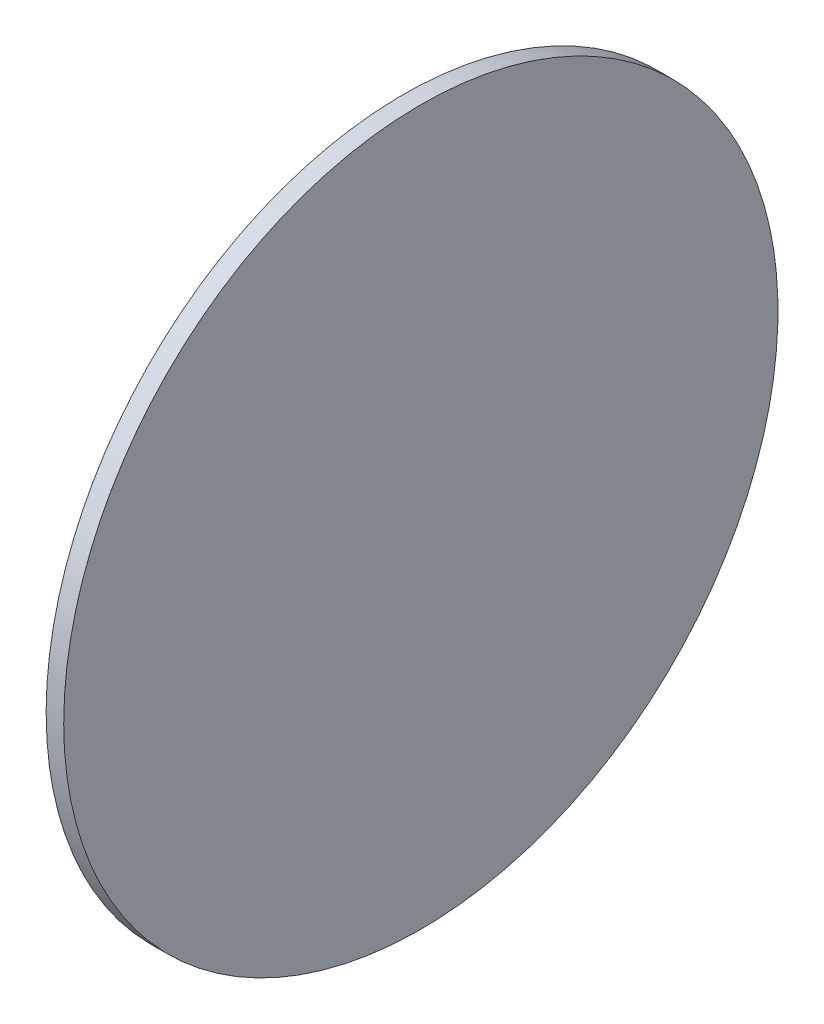
ISO-10303-21;
HEADER;
FILE_DESCRIPTION(('STEP AP214'),'2;1');
FILE_NAME('part.step','',(''),(''),'','','');
FILE_SCHEMA(('AUTOMOTIVE_DESIGN { 1 0 10303 214 1 1 1 1 }'));
ENDSEC;
DATA;
#1=APPLICATION_CONTEXT('core data for automotive mechanical design processes');
#2=APPLICATION_PROTOCOL_DEFINITION('international standard','automotive_design',2000,#1);
#3=PRODUCT_CONTEXT('',#1,'mechanical');
#4=PRODUCT('Part','Part','',(#3));
#5=PRODUCT_RELATED_PRODUCT_CATEGORY('part','',(#4));
#6=PRODUCT_DEFINITION_FORMATION('','',#4);
#7=PRODUCT_DEFINITION_CONTEXT('part definition',#1,'design');
#8=PRODUCT_DEFINITION('design','',#6,#7);
#9=PRODUCT_DEFINITION_SHAPE('','',#8);
#10=(LENGTH_UNIT() NAMED_UNIT(*) SI_UNIT(.MILLI.,.METRE.));
#11=(NAMED_UNIT(*) PLANE_ANGLE_UNIT() SI_UNIT($,.RADIAN.));
#12=(NAMED_UNIT(*) SI_UNIT($,.STERADIAN.) SOLID_ANGLE_UNIT());
#13=UNCERTAINTY_MEASURE_WITH_UNIT(LENGTH_MEASURE(1.E-05),#10,'distance_accuracy_value','');
#14=(GEOMETRIC_REPRESENTATION_CONTEXT(3) GLOBAL_UNCERTAINTY_ASSIGNED_CONTEXT((#13)) GLOBAL_UNIT_ASSIGNED_CONTEXT((#10,
#11,#12)) REPRESENTATION_CONTEXT('',''));
#15=CARTESIAN_POINT('',(0.,0.,0.));
#16=DIRECTION('',(0.,0.,1.));
#17=DIRECTION('',(1.,0.,0.));
#18=AXIS2_PLACEMENT_3D('',#15,#16,#17);
#19=CARTESIAN_POINT('',(458.240366113346,276.116733993281,45.9428043668599));
#20=CARTESIAN_POINT('',(458.240366113346,273.191267889218,45.9428043668599));
#21=CARTESIAN_POINT('',(458.240366113346,267.340335681094,45.65536649926));
#22=CARTESIAN_POINT('',(458.240366113346,258.648458882321,44.3660483707524));
#23=CARTESIAN_POINT('',(458.240366113346,250.124811121997,42.2309857535274));
#24=CARTESIAN_POINT('',(458.240366113346,241.851479787554,39.2707404677329));
#25=CARTESIAN_POINT('',(458.240366113346,233.908141582405,35.5138212937059));
#26=CARTESIAN_POINT('',(458.240366113346,226.371295195737,30.996409416833));
#27=CARTESIAN_POINT('',(458.240366113346,219.313524578312,25.7620099829571));
#28=CARTESIAN_POINT('',(458.240366113346,212.802799919346,19.8610331200402));
#29=CARTESIAN_POINT('',(458.240366113346,206.90182305643,13.3503084610744));
#30=CARTESIAN_POINT('',(458.240366113346,201.667423622554,6.29253784364952));
#31=CARTESIAN_POINT('',(458.240366113346,197.150011745681,-1.24430854301872));
#32=CARTESIAN_POINT('',(458.240366113346,193.393092571654,-9.18764674816733));
#33=CARTESIAN_POINT('',(458.240366113346,190.432847285859,-17.4609780826104));
#34=CARTESIAN_POINT('',(458.240366113346,188.297784668634,-25.9846258429343));
#35=CARTESIAN_POINT('',(458.240366113346,187.008466540127,-34.6765026417073));
#36=CARTESIAN_POINT('',(458.240366113346,186.577309738727,-43.452900953894));
#37=CARTESIAN_POINT('',(458.240366113346,187.008466540127,-52.2292992660806));
#38=CARTESIAN_POINT('',(458.240366113346,188.297784668634,-60.9211760648535));
#39=CARTESIAN_POINT('',(458.240366113346,190.432847285859,-69.4448238251775));
#40=CARTESIAN_POINT('',(458.240366113346,193.393092571654,-77.7181551596206));
#41=CARTESIAN_POINT('',(458.240366113346,197.150011745681,-85.6614933647691));
#42=CARTESIAN_POINT('',(458.240366113346,201.667423622554,-93.1983397514374));
#43=CARTESIAN_POINT('',(458.240366113346,206.90182305643,-100.256110368862));
#44=CARTESIAN_POINT('',(458.240366113346,212.802799919347,-106.766835027828));
#45=CARTESIAN_POINT('',(458.240366113346,219.313524578312,-112.667811890745));
#46=CARTESIAN_POINT('',(458.240366113346,226.371295195737,-117.902211324621));
#47=CARTESIAN_POINT('',(458.240366113346,233.908141582405,-122.419623201494));
#48=CARTESIAN_POINT('',(458.240366113346,241.851479787554,-126.176542375521));
#49=CARTESIAN_POINT('',(458.240366113346,250.124811121997,-129.136787661315));
#50=CARTESIAN_POINT('',(458.240366113346,258.648458882321,-131.27185027854));
#51=CARTESIAN_POINT('',(458.240366113346,267.340335681094,-132.561168407048));
#52=CARTESIAN_POINT('',(458.240366113346,276.116733993281,-132.992325208448));
#53=CARTESIAN_POINT('',(458.240366113346,284.893132305467,-132.561168407048));
#54=CARTESIAN_POINT('',(458.240366113346,293.58500910424,-131.27185027854));
#55=CARTESIAN_POINT('',(458.240366113346,302.108656864564,-129.136787661315));
#56=CARTESIAN_POINT('',(458.240366113346,310.381988199007,-126.176542375521));
#57=CARTESIAN_POINT('',(458.240366113346,318.325326404156,-122.419623201494));
#58=CARTESIAN_POINT('',(458.240366113346,325.862172790824,-117.902211324621));
#59=CARTESIAN_POINT('',(458.240366113346,332.919943408249,-112.667811890745));
#60=CARTESIAN_POINT('',(458.240366113346,339.430668067215,-106.766835027828));
#61=CARTESIAN_POINT('',(458.240366113346,345.331644930132,-100.256110368862));
#62=CARTESIAN_POINT('',(458.240366113346,350.566044364008,-93.1983397514374));
#63=CARTESIAN_POINT('',(458.240366113346,355.08345624088,-85.6614933647692));
#64=CARTESIAN_POINT('',(458.240366113346,358.840375414908,-77.7181551596207));
#65=CARTESIAN_POINT('',(458.240366113346,361.800620700702,-69.4448238251775));
#66=CARTESIAN_POINT('',(458.240366113346,363.935683317927,-60.9211760648536));
#67=CARTESIAN_POINT('',(458.240366113346,365.225001446435,-52.2292992660807));
#68=CARTESIAN_POINT('',(458.240366113346,365.656158247834,-43.4529009538939));
#69=CARTESIAN_POINT('',(458.240366113346,365.225001446435,-34.6765026417073));
#70=CARTESIAN_POINT('',(458.240366113346,363.935683317927,-25.9846258429344));
#71=CARTESIAN_POINT('',(458.240366113346,361.800620700702,-17.4609780826103));
#72=CARTESIAN_POINT('',(458.240366113346,358.840375414908,-9.18764674816738));
#73=CARTESIAN_POINT('',(458.240366113346,355.08345624088,-1.24430854301868));
#74=CARTESIAN_POINT('',(458.240366113346,350.566044364008,6.29253784364942));
#75=CARTESIAN_POINT('',(458.240366113346,345.331644930132,13.3503084610744));
#76=CARTESIAN_POINT('',(458.240366113346,339.430668067215,19.8610331200402));
#77=CARTESIAN_POINT('',(458.240366113346,332.919943408249,25.7620099829571));
#78=CARTESIAN_POINT('',(458.240366113346,325.862172790824,30.996409416833));
#79=CARTESIAN_POINT('',(458.240366113346,318.325326404156,35.5138212937059));
#80=CARTESIAN_POINT('',(458.240366113346,310.381988199007,39.2707404677329));
#81=CARTESIAN_POINT('',(458.240366113346,302.108656864564,42.2309857535274));
#82=CARTESIAN_POINT('',(458.240366113346,293.58500910424,44.3660483707524));
#83=CARTESIAN_POINT('',(458.240366113346,284.893132305467,45.65536649926));
#84=CARTESIAN_POINT('',(458.240366113346,279.042200097343,45.9428043668599));
#85=CARTESIAN_POINT('',(458.240366113346,276.116733993281,45.9428043668599));
#86=B_SPLINE_CURVE_WITH_KNOTS('',3,(#19,#20,#21,#22,#23,#24,#25,#26,#27,#28,#29,#30,#31,#32,#33,
#34,#35,#36,#37,#38,#39,#40,#41,#42,#43,#44,#45,#46,#47,#48,#49,#50,#51,#52,#53,#54,#55,#56,#57,
#58,#59,#60,#61,#62,#63,#64,#65,#66,#67,#68,#69,#70,#71,#72,#73,#74,#75,#76,#77,#78,#79,#80,#81,
#82,#83,#84,#85),.UNSPECIFIED.,.T.,.F.,(4,1,1,1,1,1,1,1,1,1,1,1,1,1,1,1,1,1,1,1,1,1,1,1,1,1,1,1,
1,1,1,1,1,1,1,1,1,1,1,1,1,1,1,1,1,1,1,1,1,1,1,1,1,1,1,1,1,1,1,1,1,1,1,1,4),(0.,0.015625,0.03125,
0.0468749999999999,0.0625,0.078125,0.09375,0.109375,0.125,0.140625,0.15625,0.171875,0.1875,
0.203125,0.21875,0.234375,0.25,0.265625,0.28125,0.296875,0.3125,0.328125,0.34375,0.359375,0.375,
0.390625,0.40625,0.421875,0.4375,0.453125,0.46875,0.484375,0.5,0.515625,0.53125,0.546875,0.5625,
0.578125,0.59375,0.609375,0.625,0.640625,0.65625,0.671875,0.6875,0.703125,0.71875,0.734375,0.75,
0.765625,0.78125,0.796875,0.8125,0.828125,0.84375,0.859375,0.875,0.890625,0.90625,0.921875,
0.9375,0.953125,0.96875,0.984375,1.),.UNSPECIFIED.);
#87=DIRECTION('',(1.,0.,0.));
#88=VECTOR('',#87,1.);
#89=SURFACE_OF_LINEAR_EXTRUSION('',#86,#88);
#90=CARTESIAN_POINT('',(458.240366113346,276.116733993281,45.9428043668599));
#91=CARTESIAN_POINT('',(458.240366113346,273.191267889218,45.9428043668599));
#92=CARTESIAN_POINT('',(458.240366113346,267.340335681094,45.65536649926));
#93=CARTESIAN_POINT('',(458.240366113346,258.648458882321,44.3660483707524));
#94=CARTESIAN_POINT('',(458.240366113346,250.124811121997,42.2309857535274));
#95=CARTESIAN_POINT('',(458.240366113346,241.851479787554,39.2707404677329));
#96=CARTESIAN_POINT('',(458.240366113346,233.908141582405,35.5138212937059));
#97=CARTESIAN_POINT('',(458.240366113346,226.371295195737,30.996409416833));
#98=CARTESIAN_POINT('',(458.240366113346,219.313524578312,25.7620099829571));
#99=CARTESIAN_POINT('',(458.240366113346,212.802799919346,19.8610331200402));
#100=CARTESIAN_POINT('',(458.240366113346,206.90182305643,13.3503084610744));
#101=CARTESIAN_POINT('',(458.240366113346,201.667423622554,6.29253784364952));
#102=CARTESIAN_POINT('',(458.240366113346,197.150011745681,-1.24430854301872));
#103=CARTESIAN_POINT('',(458.240366113346,193.393092571654,-9.18764674816733));
#104=CARTESIAN_POINT('',(458.240366113346,190.432847285859,-17.4609780826104));
#105=CARTESIAN_POINT('',(458.240366113346,188.297784668634,-25.9846258429343));
#106=CARTESIAN_POINT('',(458.240366113346,187.008466540127,-34.6765026417073));
#107=CARTESIAN_POINT('',(458.240366113346,186.577309738727,-43.452900953894));
#108=CARTESIAN_POINT('',(458.240366113346,187.008466540127,-52.2292992660806));
#109=CARTESIAN_POINT('',(458.240366113346,188.297784668634,-60.9211760648535));
#110=CARTESIAN_POINT('',(458.240366113346,190.432847285859,-69.4448238251775));
#111=CARTESIAN_POINT('',(458.240366113346,193.393092571654,-77.7181551596206));
#112=CARTESIAN_POINT('',(458.240366113346,197.150011745681,-85.6614933647691));
#113=CARTESIAN_POINT('',(458.240366113346,201.667423622554,-93.1983397514374));
#114=CARTESIAN_POINT('',(458.240366113346,206.90182305643,-100.256110368862));
#115=CARTESIAN_POINT('',(458.240366113346,212.802799919347,-106.766835027828));
#116=CARTESIAN_POINT('',(458.240366113346,219.313524578312,-112.667811890745));
#117=CARTESIAN_POINT('',(458.240366113346,226.371295195737,-117.902211324621));
#118=CARTESIAN_POINT('',(458.240366113346,233.908141582405,-122.419623201494));
#119=CARTESIAN_POINT('',(458.240366113346,241.851479787554,-126.176542375521));
#120=CARTESIAN_POINT('',(458.240366113346,250.124811121997,-129.136787661315));
#121=CARTESIAN_POINT('',(458.240366113346,258.648458882321,-131.27185027854));
#122=CARTESIAN_POINT('',(458.240366113346,267.340335681094,-132.561168407048));
#123=CARTESIAN_POINT('',(458.240366113346,276.116733993281,-132.992325208448));
#124=CARTESIAN_POINT('',(458.240366113346,284.893132305467,-132.561168407048));
#125=CARTESIAN_POINT('',(458.240366113346,293.58500910424,-131.27185027854));
#126=CARTESIAN_POINT('',(458.240366113346,302.108656864564,-129.136787661315));
#127=CARTESIAN_POINT('',(458.240366113346,310.381988199007,-126.176542375521));
#128=CARTESIAN_POINT('',(458.240366113346,318.325326404156,-122.419623201494));
#129=CARTESIAN_POINT('',(458.240366113346,325.862172790824,-117.902211324621));
#130=CARTESIAN_POINT('',(458.240366113346,332.919943408249,-112.667811890745));
#131=CARTESIAN_POINT('',(458.240366113346,339.430668067215,-106.766835027828));
#132=CARTESIAN_POINT('',(458.240366113346,345.331644930132,-100.256110368862));
#133=CARTESIAN_POINT('',(458.240366113346,350.566044364008,-93.1983397514374));
#134=CARTESIAN_POINT('',(458.240366113346,355.08345624088,-85.6614933647692));
#135=CARTESIAN_POINT('',(458.240366113346,358.840375414908,-77.7181551596207));
#136=CARTESIAN_POINT('',(458.240366113346,361.800620700702,-69.4448238251775));
#137=CARTESIAN_POINT('',(458.240366113346,363.935683317927,-60.9211760648536));
#138=CARTESIAN_POINT('',(458.240366113346,365.225001446435,-52.2292992660807));
#139=CARTESIAN_POINT('',(458.240366113346,365.656158247834,-43.4529009538939));
#140=CARTESIAN_POINT('',(458.240366113346,365.225001446435,-34.6765026417073));
#141=CARTESIAN_POINT('',(458.240366113346,363.935683317927,-25.9846258429344));
#142=CARTESIAN_POINT('',(458.240366113346,361.800620700702,-17.4609780826103));
#143=CARTESIAN_POINT('',(458.240366113346,358.840375414908,-9.18764674816738));
#144=CARTESIAN_POINT('',(458.240366113346,355.08345624088,-1.24430854301868));
#145=CARTESIAN_POINT('',(458.240366113346,350.566044364008,6.29253784364942));
#146=CARTESIAN_POINT('',(458.240366113346,345.331644930132,13.3503084610744));
#147=CARTESIAN_POINT('',(458.240366113346,339.430668067215,19.8610331200402));
#148=CARTESIAN_POINT('',(458.240366113346,332.919943408249,25.7620099829571));
#149=CARTESIAN_POINT('',(458.240366113346,325.862172790824,30.996409416833));
#150=CARTESIAN_POINT('',(458.240366113346,318.325326404156,35.5138212937059));
#151=CARTESIAN_POINT('',(458.240366113346,310.381988199007,39.2707404677329));
#152=CARTESIAN_POINT('',(458.240366113346,302.108656864564,42.2309857535274));
#153=CARTESIAN_POINT('',(458.240366113346,293.58500910424,44.3660483707524));
#154=CARTESIAN_POINT('',(458.240366113346,284.893132305467,45.65536649926));
#155=CARTESIAN_POINT('',(458.240366113346,279.042200097343,45.9428043668599));
#156=CARTESIAN_POINT('',(458.240366113346,276.116733993281,45.9428043668599));
#157=B_SPLINE_CURVE_WITH_KNOTS('',3,(#90,#91,#92,#93,#94,#95,#96,#97,#98,#99,#100,#101,#102,
#103,#104,#105,#106,#107,#108,#109,#110,#111,#112,#113,#114,#115,#116,#117,#118,#119,#120,#121,
#122,#123,#124,#125,#126,#127,#128,#129,#130,#131,#132,#133,#134,#135,#136,#137,#138,#139,#140,
#141,#142,#143,#144,#145,#146,#147,#148,#149,#150,#151,#152,#153,#154,#155,#156),.UNSPECIFIED.,
.T.,.F.,(4,1,1,1,1,1,1,1,1,1,1,1,1,1,1,1,1,1,1,1,1,1,1,1,1,1,1,1,1,1,1,1,1,1,1,1,1,1,1,1,1,1,1,
1,1,1,1,1,1,1,1,1,1,1,1,1,1,1,1,1,1,1,1,1,4),(0.,0.015625,0.03125,0.0468749999999999,0.0625,
0.078125,0.09375,0.109375,0.125,0.140625,0.15625,0.171875,0.1875,0.203125,0.21875,0.234375,0.25,
0.265625,0.28125,0.296875,0.3125,0.328125,0.34375,0.359375,0.375,0.390625,0.40625,0.421875,
0.4375,0.453125,0.46875,0.484375,0.5,0.515625,0.53125,0.546875,0.5625,0.578125,0.59375,0.609375,
0.625,0.640625,0.65625,0.671875,0.6875,0.703125,0.71875,0.734375,0.75,0.765625,0.78125,0.796875,
0.8125,0.828125,0.84375,0.859375,0.875,0.890625,0.90625,0.921875,0.9375,0.953125,0.96875,
0.984375,1.),.UNSPECIFIED.);
#158=CARTESIAN_POINT('',(458.240366113346,276.116733993281,45.9428043668599));
#159=VERTEX_POINT('',#158);
#160=EDGE_CURVE('E10',#159,#159,#157,.T.);
#161=ORIENTED_EDGE('',*,*,#160,.T.);
#162=EDGE_LOOP('',(#161));
#163=FACE_BOUND('',#162,.T.);
#164=CARTESIAN_POINT('',(462.634741800947,276.116733993281,45.9428043668599));
#165=CARTESIAN_POINT('',(462.634741800947,277.579467045312,45.9428043668599));
#166=CARTESIAN_POINT('',(462.634741800947,279.042200097343,45.9068746334099));
#167=CARTESIAN_POINT('',(462.634741800947,281.96414447168,45.7633287110971));
#168=CARTESIAN_POINT('',(462.634741800947,283.423355793985,45.6557125222343));
#169=CARTESIAN_POINT('',(462.634741800948,286.334734979145,45.3689667005831));
#170=CARTESIAN_POINT('',(462.634741800948,287.786902841999,45.1898370677946));
#171=CARTESIAN_POINT('',(462.634741800948,290.680707294714,44.7605817265584));
#172=CARTESIAN_POINT('',(462.634741800948,292.122343884574,44.5104560181105));
#173=CARTESIAN_POINT('',(462.634741800948,294.991597977757,43.9397258938218));
#174=CARTESIAN_POINT('',(462.634741800948,296.41921548108,43.6191214779808));
#175=CARTESIAN_POINT('',(462.634741800948,299.257011093378,42.908290681412));
#176=CARTESIAN_POINT('',(462.634741800948,300.667189202353,42.5180643006841));
#177=CARTESIAN_POINT('',(462.634741800948,303.466685718148,41.6688463168475));
#178=CARTESIAN_POINT('',(462.634741800948,304.856004124967,41.2098547137389));
#179=CARTESIAN_POINT('',(462.634741800948,307.610461373806,40.2242941509881));
#180=CARTESIAN_POINT('',(462.634741800948,308.975600215826,39.697725191346));
#181=CARTESIAN_POINT('',(462.634741800948,311.678378472424,38.5781977813758));
#182=CARTESIAN_POINT('',(462.634741800948,313.016017887003,37.9852393310476));
#183=CARTESIAN_POINT('',(462.634741800948,315.660609843336,36.7344404890964));
#184=CARTESIAN_POINT('',(462.634741800948,316.967562385091,36.0766000974733));
#185=CARTESIAN_POINT('',(462.634741800948,319.547593150394,34.6975449223233));
#186=CARTESIAN_POINT('',(462.634741800948,320.820671373942,33.9763301387964));
#187=CARTESIAN_POINT('',(462.634741800948,323.32992917155,32.4723388942488));
#188=CARTESIAN_POINT('',(462.634741800948,324.566108745609,31.6895624332283));
#189=CARTESIAN_POINT('',(462.634741800948,326.998544912958,30.0642605481035));
#190=CARTESIAN_POINT('',(462.634741800947,328.194801506247,29.2217351239993));
#191=CARTESIAN_POINT('',(462.634741800947,330.544559620838,27.4790357347057));
#192=CARTESIAN_POINT('',(462.634741800948,331.69806114214,26.5788617695164));
#193=CARTESIAN_POINT('',(462.634741800948,333.959477021538,24.7229657200509));
#194=CARTESIAN_POINT('',(462.634741800948,335.067391379635,23.7672436357748));
#195=CARTESIAN_POINT('',(462.634741800948,337.235020356058,21.8026192495105));
#196=CARTESIAN_POINT('',(462.634741800948,338.294734974383,20.7937169475223));
#197=CARTESIAN_POINT('',(462.634741800948,340.363351894697,18.7251000272086));
#198=CARTESIAN_POINT('',(462.634741800948,341.372254196685,17.6653854088829));
#199=CARTESIAN_POINT('',(462.634741800948,343.336878582949,15.4977564324606));
#200=CARTESIAN_POINT('',(462.634741800947,344.292600667225,14.3898420743638));
#201=CARTESIAN_POINT('',(462.634741800947,346.148496716691,12.1284261949654));
#202=CARTESIAN_POINT('',(462.634741800947,347.04867068188,10.9749246736637));
#203=CARTESIAN_POINT('',(462.634741800947,348.791370071174,8.62516655907268));
#204=CARTESIAN_POINT('',(462.634741800948,349.633895495278,7.42890996578341));
#205=CARTESIAN_POINT('',(462.634741800948,351.259197380403,4.99647379843455));
#206=CARTESIAN_POINT('',(462.634741800948,352.041973841423,3.76029422437497));
#207=CARTESIAN_POINT('',(462.634741800948,353.545965085971,1.25103642676736));
#208=CARTESIAN_POINT('',(462.634741800948,354.267179869498,-0.0220417967806705));
#209=CARTESIAN_POINT('',(462.634741800948,355.646235044648,-2.60207256208347));
#210=CARTESIAN_POINT('',(462.634741800948,356.304075436271,-3.90902510383824));
#211=CARTESIAN_POINT('',(462.634741800948,357.554874278222,-6.55361706017171));
#212=CARTESIAN_POINT('',(462.634741800948,358.14783272855,-7.89125647475042));
#213=CARTESIAN_POINT('',(462.634741800948,359.267360138521,-10.594034731349));
#214=CARTESIAN_POINT('',(462.634741800948,359.793929098163,-11.9591735733689));
#215=CARTESIAN_POINT('',(462.634741800948,360.779489660913,-14.7136308222077));
#216=CARTESIAN_POINT('',(462.634741800948,361.238481264022,-16.1029492290266));
#217=CARTESIAN_POINT('',(462.634741800948,362.087699247859,-18.9024457448211));
#218=CARTESIAN_POINT('',(462.634741800948,362.477925628587,-20.3126238537967));
#219=CARTESIAN_POINT('',(462.634741800947,363.188756425155,-23.150419466095));
#220=CARTESIAN_POINT('',(462.634741800947,363.509360840996,-24.5780369694178));
#221=CARTESIAN_POINT('',(462.634741800947,364.080090965285,-27.4472910626006));
#222=CARTESIAN_POINT('',(462.634741800947,364.330216673733,-28.8889276524607));
#223=CARTESIAN_POINT('',(462.634741800948,364.759472014969,-31.7827321051752));
#224=CARTESIAN_POINT('',(462.634741800948,364.938601647758,-33.2348999680296));
#225=CARTESIAN_POINT('',(462.634741800948,365.225347469409,-36.1462791531895));
#226=CARTESIAN_POINT('',(462.634741800948,365.332963658272,-37.6054904754951));
#227=CARTESIAN_POINT('',(462.634741800948,365.476509580585,-40.5274348498317));
#228=CARTESIAN_POINT('',(462.634741800948,365.512439314035,-41.9901679018628));
#229=CARTESIAN_POINT('',(462.634741800948,365.512439314035,-44.915634005925));
#230=CARTESIAN_POINT('',(462.634741800948,365.476509580584,-46.3783670579561));
#231=CARTESIAN_POINT('',(462.634741800948,365.332963658272,-49.3003114322928));
#232=CARTESIAN_POINT('',(462.634741800948,365.225347469409,-50.7595227545983));
#233=CARTESIAN_POINT('',(462.634741800948,364.938601647758,-53.6709019397583));
#234=CARTESIAN_POINT('',(462.634741800948,364.759472014969,-55.1230698026127));
#235=CARTESIAN_POINT('',(462.634741800948,364.330216673733,-58.0168742553272));
#236=CARTESIAN_POINT('',(462.634741800948,364.080090965285,-59.4585108451873));
#237=CARTESIAN_POINT('',(462.634741800948,363.509360840996,-62.3277649383701));
#238=CARTESIAN_POINT('',(462.634741800948,363.188756425155,-63.7553824416928));
#239=CARTESIAN_POINT('',(462.634741800948,362.477925628587,-66.5931780539911));
#240=CARTESIAN_POINT('',(462.634741800948,362.087699247859,-68.0033561629667));
#241=CARTESIAN_POINT('',(462.634741800948,361.238481264022,-70.8028526787612));
#242=CARTESIAN_POINT('',(462.634741800948,360.779489660913,-72.1921710855801));
#243=CARTESIAN_POINT('',(462.634741800948,359.793929098163,-74.9466283344189));
#244=CARTESIAN_POINT('',(462.634741800948,359.267360138521,-76.3117671764388));
#245=CARTESIAN_POINT('',(462.634741800948,358.14783272855,-79.0145454330374));
#246=CARTESIAN_POINT('',(462.634741800948,357.554874278222,-80.3521848476162));
#247=CARTESIAN_POINT('',(462.634741800948,356.304075436271,-82.9967768039496));
#248=CARTESIAN_POINT('',(462.634741800948,355.646235044648,-84.3037293457044));
#249=CARTESIAN_POINT('',(462.634741800948,354.267179869498,-86.8837601110072));
#250=CARTESIAN_POINT('',(462.634741800948,353.545965085971,-88.1568383345552));
#251=CARTESIAN_POINT('',(462.634741800948,352.041973841423,-90.6660961321628));
#252=CARTESIAN_POINT('',(462.634741800948,351.259197380403,-91.9022757062224));
#253=CARTESIAN_POINT('',(462.634741800948,349.633895495278,-94.3347118735713));
#254=CARTESIAN_POINT('',(462.634741800948,348.791370071174,-95.5309684668605));
#255=CARTESIAN_POINT('',(462.634741800947,347.04867068188,-97.8807265814515));
#256=CARTESIAN_POINT('',(462.634741800947,346.148496716691,-99.0342281027532));
#257=CARTESIAN_POINT('',(462.634741800947,344.292600667226,-101.295643982152));
#258=CARTESIAN_POINT('',(462.634741800947,343.336878582949,-102.403558340248));
#259=CARTESIAN_POINT('',(462.634741800948,341.372254196685,-104.571187316671));
#260=CARTESIAN_POINT('',(462.634741800948,340.363351894697,-105.630901934996));
#261=CARTESIAN_POINT('',(462.634741800948,338.294734974383,-107.69951885531));
#262=CARTESIAN_POINT('',(462.634741800948,337.235020356058,-108.708421157298));
#263=CARTESIAN_POINT('',(462.634741800948,335.067391379635,-110.673045543563));
#264=CARTESIAN_POINT('',(462.634741800948,333.959477021538,-111.628767627839));
#265=CARTESIAN_POINT('',(462.634741800948,331.69806114214,-113.484663677304));
#266=CARTESIAN_POINT('',(462.634741800948,330.544559620838,-114.384837642494));
#267=CARTESIAN_POINT('',(462.634741800948,328.194801506247,-116.127537031787));
#268=CARTESIAN_POINT('',(462.634741800947,326.998544912958,-116.970062455891));
#269=CARTESIAN_POINT('',(462.634741800947,324.566108745609,-118.595364341016));
#270=CARTESIAN_POINT('',(462.634741800948,323.32992917155,-119.378140802037));
#271=CARTESIAN_POINT('',(462.634741800948,320.820671373942,-120.882132046584));
#272=CARTESIAN_POINT('',(462.634741800948,319.547593150394,-121.603346830111));
#273=CARTESIAN_POINT('',(462.634741800948,316.967562385091,-122.982402005261));
#274=CARTESIAN_POINT('',(462.634741800948,315.660609843336,-123.640242396884));
#275=CARTESIAN_POINT('',(462.634741800948,313.016017887003,-124.891041238835));
#276=CARTESIAN_POINT('',(462.634741800948,311.678378472424,-125.483999689164));
#277=CARTESIAN_POINT('',(462.634741800948,308.975600215826,-126.603527099134));
#278=CARTESIAN_POINT('',(462.634741800948,307.610461373806,-127.130096058776));
#279=CARTESIAN_POINT('',(462.634741800948,304.856004124967,-128.115656621527));
#280=CARTESIAN_POINT('',(462.634741800948,303.466685718148,-128.574648224635));
#281=CARTESIAN_POINT('',(462.634741800948,300.667189202353,-129.423866208472));
#282=CARTESIAN_POINT('',(462.634741800948,299.257011093378,-129.8140925892));
#283=CARTESIAN_POINT('',(462.634741800948,296.41921548108,-130.524923385769));
#284=CARTESIAN_POINT('',(462.634741800948,294.991597977757,-130.84552780161));
#285=CARTESIAN_POINT('',(462.634741800948,292.122343884574,-131.416257925898));
#286=CARTESIAN_POINT('',(462.634741800948,290.680707294714,-131.666383634346));
#287=CARTESIAN_POINT('',(462.634741800948,287.786902841999,-132.095638975583));
#288=CARTESIAN_POINT('',(462.634741800948,286.334734979145,-132.274768608371));
#289=CARTESIAN_POINT('',(462.634741800948,283.423355793985,-132.561514430022));
#290=CARTESIAN_POINT('',(462.634741800948,281.96414447168,-132.669130618885));
#291=CARTESIAN_POINT('',(462.634741800948,279.042200097343,-132.812676541198));
#292=CARTESIAN_POINT('',(462.634741800947,277.579467045312,-132.848606274648));
#293=CARTESIAN_POINT('',(462.634741800947,274.65400094125,-132.848606274648));
#294=CARTESIAN_POINT('',(462.634741800947,273.191267889219,-132.812676541198));
#295=CARTESIAN_POINT('',(462.634741800947,270.269323514882,-132.669130618885));
#296=CARTESIAN_POINT('',(462.634741800948,268.810112192576,-132.561514430022));
#297=CARTESIAN_POINT('',(462.634741800948,265.898733007417,-132.274768608371));
#298=CARTESIAN_POINT('',(462.634741800948,264.446565144562,-132.095638975583));
#299=CARTESIAN_POINT('',(462.634741800948,261.552760691848,-131.666383634346));
#300=CARTESIAN_POINT('',(462.634741800948,260.111124101987,-131.416257925899));
#301=CARTESIAN_POINT('',(462.634741800948,257.241870008804,-130.84552780161));
#302=CARTESIAN_POINT('',(462.634741800948,255.814252505482,-130.524923385769));
#303=CARTESIAN_POINT('',(462.634741800948,252.976456893183,-129.8140925892));
#304=CARTESIAN_POINT('',(462.634741800948,251.566278784208,-129.423866208472));
#305=CARTESIAN_POINT('',(462.634741800948,248.766782268413,-128.574648224635));
#306=CARTESIAN_POINT('',(462.634741800948,247.377463861595,-128.115656621527));
#307=CARTESIAN_POINT('',(462.634741800947,244.623006612756,-127.130096058776));
#308=CARTESIAN_POINT('',(462.634741800947,243.257867770736,-126.603527099134));
#309=CARTESIAN_POINT('',(462.634741800947,240.555089514137,-125.483999689164));
#310=CARTESIAN_POINT('',(462.634741800948,239.217450099559,-124.891041238835));
#311=CARTESIAN_POINT('',(462.634741800948,236.572858143225,-123.640242396884));
#312=CARTESIAN_POINT('',(462.634741800948,235.26590560147,-122.982402005261));
#313=CARTESIAN_POINT('',(462.634741800948,232.685874836167,-121.603346830111));
#314=CARTESIAN_POINT('',(462.634741800948,231.412796612619,-120.882132046584));
#315=CARTESIAN_POINT('',(462.634741800948,228.903538815012,-119.378140802037));
#316=CARTESIAN_POINT('',(462.634741800948,227.667359240952,-118.595364341016));
#317=CARTESIAN_POINT('',(462.634741800948,225.234923073603,-116.970062455891));
#318=CARTESIAN_POINT('',(462.634741800948,224.038666480314,-116.127537031787));
#319=CARTESIAN_POINT('',(462.634741800948,221.688908365723,-114.384837642494));
#320=CARTESIAN_POINT('',(462.634741800948,220.535406844421,-113.484663677304));
#321=CARTESIAN_POINT('',(462.634741800948,218.273990965023,-111.628767627839));
#322=CARTESIAN_POINT('',(462.634741800948,217.166076606926,-110.673045543563));
#323=CARTESIAN_POINT('',(462.634741800948,214.998447630504,-108.708421157298));
#324=CARTESIAN_POINT('',(462.634741800948,213.938733012178,-107.69951885531));
#325=CARTESIAN_POINT('',(462.634741800948,211.870116091864,-105.630901934996));
#326=CARTESIAN_POINT('',(462.634741800948,210.861213789876,-104.571187316671));
#327=CARTESIAN_POINT('',(462.634741800948,208.896589403612,-102.403558340248));
#328=CARTESIAN_POINT('',(462.634741800948,207.940867319336,-101.295643982152));
#329=CARTESIAN_POINT('',(462.634741800948,206.08497126987,-99.0342281027532));
#330=CARTESIAN_POINT('',(462.634741800948,205.184797304681,-97.8807265814516));
#331=CARTESIAN_POINT('',(462.634741800948,203.442097915388,-95.5309684668606));
#332=CARTESIAN_POINT('',(462.634741800948,202.599572491283,-94.3347118735713));
#333=CARTESIAN_POINT('',(462.634741800948,200.974270606159,-91.9022757062224));
#334=CARTESIAN_POINT('',(462.634741800948,200.191494145138,-90.6660961321628));
#335=CARTESIAN_POINT('',(462.634741800948,198.68750290059,-88.1568383345552));
#336=CARTESIAN_POINT('',(462.634741800948,197.966288117063,-86.8837601110072));
#337=CARTESIAN_POINT('',(462.634741800948,196.587232941913,-84.3037293457044));
#338=CARTESIAN_POINT('',(462.634741800948,195.92939255029,-82.9967768039496));
#339=CARTESIAN_POINT('',(462.634741800948,194.678593708339,-80.3521848476162));
#340=CARTESIAN_POINT('',(462.634741800948,194.085635258011,-79.0145454330375));
#341=CARTESIAN_POINT('',(462.634741800948,192.966107848041,-76.3117671764389));
#342=CARTESIAN_POINT('',(462.634741800948,192.439538888399,-74.946628334419));
#343=CARTESIAN_POINT('',(462.634741800948,191.453978325648,-72.1921710855802));
#344=CARTESIAN_POINT('',(462.634741800948,190.994986722539,-70.8028526787613));
#345=CARTESIAN_POINT('',(462.634741800948,190.145768738703,-68.0033561629668));
#346=CARTESIAN_POINT('',(462.634741800948,189.755542357975,-66.5931780539911));
#347=CARTESIAN_POINT('',(462.634741800948,189.044711561406,-63.7553824416928));
#348=CARTESIAN_POINT('',(462.634741800948,188.724107145565,-62.3277649383701));
#349=CARTESIAN_POINT('',(462.634741800948,188.153377021276,-59.4585108451873));
#350=CARTESIAN_POINT('',(462.634741800948,187.903251312828,-58.0168742553272));
#351=CARTESIAN_POINT('',(462.634741800948,187.473995971592,-55.1230698026127));
#352=CARTESIAN_POINT('',(462.634741800948,187.294866338804,-53.6709019397583));
#353=CARTESIAN_POINT('',(462.634741800948,187.008120517152,-50.7595227545984));
#354=CARTESIAN_POINT('',(462.634741800948,186.90050432829,-49.3003114322928));
#355=CARTESIAN_POINT('',(462.634741800948,186.756958405977,-46.3783670579562));
#356=CARTESIAN_POINT('',(462.634741800948,186.721028672527,-44.9156340059251));
#357=CARTESIAN_POINT('',(462.634741800947,186.721028672527,-41.9901679018629));
#358=CARTESIAN_POINT('',(462.634741800947,186.756958405977,-40.5274348498318));
#359=CARTESIAN_POINT('',(462.634741800947,186.90050432829,-37.6054904754951));
#360=CARTESIAN_POINT('',(462.634741800947,187.008120517152,-36.1462791531896));
#361=CARTESIAN_POINT('',(462.634741800947,187.294866338804,-33.2348999680296));
#362=CARTESIAN_POINT('',(462.634741800948,187.473995971592,-31.7827321051752));
#363=CARTESIAN_POINT('',(462.634741800948,187.903251312828,-28.8889276524607));
#364=CARTESIAN_POINT('',(462.634741800948,188.153377021276,-27.4472910626006));
#365=CARTESIAN_POINT('',(462.634741800948,188.724107145565,-24.5780369694178));
#366=CARTESIAN_POINT('',(462.634741800948,189.044711561406,-23.1504194660951));
#367=CARTESIAN_POINT('',(462.634741800948,189.755542357975,-20.3126238537968));
#368=CARTESIAN_POINT('',(462.634741800948,190.145768738703,-18.9024457448212));
#369=CARTESIAN_POINT('',(462.634741800948,190.994986722539,-16.1029492290267));
#370=CARTESIAN_POINT('',(462.634741800948,191.453978325648,-14.7136308222078));
#371=CARTESIAN_POINT('',(462.634741800948,192.439538888399,-11.959173573369));
#372=CARTESIAN_POINT('',(462.634741800948,192.966107848041,-10.5940347313491));
#373=CARTESIAN_POINT('',(462.634741800948,194.085635258011,-7.89125647475046));
#374=CARTESIAN_POINT('',(462.634741800948,194.678593708339,-6.55361706017175));
#375=CARTESIAN_POINT('',(462.634741800948,195.92939255029,-3.90902510383829));
#376=CARTESIAN_POINT('',(462.634741800948,196.587232941913,-2.60207256208354));
#377=CARTESIAN_POINT('',(462.634741800948,197.966288117063,-0.0220417967807273));
#378=CARTESIAN_POINT('',(462.634741800948,198.68750290059,1.25103642676733));
#379=CARTESIAN_POINT('',(462.634741800948,200.191494145138,3.76029422437495));
#380=CARTESIAN_POINT('',(462.634741800947,200.974270606158,4.99647379843452));
#381=CARTESIAN_POINT('',(462.634741800947,202.599572491283,7.42890996578337));
#382=CARTESIAN_POINT('',(462.634741800947,203.442097915387,8.62516655907265));
#383=CARTESIAN_POINT('',(462.634741800947,205.184797304681,10.9749246736636));
#384=CARTESIAN_POINT('',(462.634741800947,206.08497126987,12.1284261949653));
#385=CARTESIAN_POINT('',(462.634741800947,207.940867319336,14.3898420743638));
#386=CARTESIAN_POINT('',(462.634741800948,208.896589403612,15.4977564324605));
#387=CARTESIAN_POINT('',(462.634741800948,210.861213789876,17.6653854088829));
#388=CARTESIAN_POINT('',(462.634741800948,211.870116091864,18.7251000272085));
#389=CARTESIAN_POINT('',(462.634741800948,213.938733012178,20.7937169475223));
#390=CARTESIAN_POINT('',(462.634741800948,214.998447630504,21.8026192495105));
#391=CARTESIAN_POINT('',(462.634741800948,217.166076606926,23.7672436357748));
#392=CARTESIAN_POINT('',(462.634741800948,218.273990965023,24.7229657200509));
#393=CARTESIAN_POINT('',(462.634741800948,220.535406844421,26.5788617695163));
#394=CARTESIAN_POINT('',(462.634741800948,221.688908365723,27.4790357347057));
#395=CARTESIAN_POINT('',(462.634741800948,224.038666480314,29.2217351239992));
#396=CARTESIAN_POINT('',(462.634741800948,225.234923073603,30.0642605481034));
#397=CARTESIAN_POINT('',(462.634741800948,227.667359240952,31.6895624332282));
#398=CARTESIAN_POINT('',(462.634741800948,228.903538815012,32.4723388942488));
#399=CARTESIAN_POINT('',(462.634741800948,231.412796612619,33.9763301387963));
#400=CARTESIAN_POINT('',(462.634741800948,232.685874836167,34.6975449223232));
#401=CARTESIAN_POINT('',(462.634741800947,235.26590560147,36.0766000974732));
#402=CARTESIAN_POINT('',(462.634741800947,236.572858143225,36.7344404890963));
#403=CARTESIAN_POINT('',(462.634741800947,239.217450099558,37.9852393310476));
#404=CARTESIAN_POINT('',(462.634741800947,240.555089514137,38.5781977813757));
#405=CARTESIAN_POINT('',(462.634741800947,243.257867770736,39.697725191346));
#406=CARTESIAN_POINT('',(462.634741800947,244.623006612756,40.2242941509881));
#407=CARTESIAN_POINT('',(462.634741800948,247.377463861594,41.2098547137388));
#408=CARTESIAN_POINT('',(462.634741800948,248.766782268413,41.6688463168475));
#409=CARTESIAN_POINT('',(462.634741800948,251.566278784208,42.5180643006841));
#410=CARTESIAN_POINT('',(462.634741800948,252.976456893183,42.908290681412));
#411=CARTESIAN_POINT('',(462.634741800948,255.814252505482,43.6191214779808));
#412=CARTESIAN_POINT('',(462.634741800948,257.241870008804,43.9397258938218));
#413=CARTESIAN_POINT('',(462.634741800948,260.111124101987,44.5104560181105));
#414=CARTESIAN_POINT('',(462.634741800948,261.552760691847,44.7605817265584));
#415=CARTESIAN_POINT('',(462.634741800948,264.446565144562,45.1898370677947));
#416=CARTESIAN_POINT('',(462.634741800948,265.898733007416,45.3689667005831));
#417=CARTESIAN_POINT('',(462.634741800948,268.810112192576,45.6557125222343));
#418=CARTESIAN_POINT('',(462.634741800948,270.269323514882,45.7633287110971));
#419=CARTESIAN_POINT('',(462.634741800948,273.191267889218,45.9068746334099));
#420=CARTESIAN_POINT('',(462.634741800948,274.65400094125,45.9428043668599));
#421=CARTESIAN_POINT('',(462.634741800947,276.116733993281,45.9428043668599));
#422=B_SPLINE_CURVE_WITH_KNOTS('',3,(#164,#165,#166,#167,#168,#169,#170,#171,#172,#173,#174,
#175,#176,#177,#178,#179,#180,#181,#182,#183,#184,#185,#186,#187,#188,#189,#190,#191,#192,#193,
#194,#195,#196,#197,#198,#199,#200,#201,#202,#203,#204,#205,#206,#207,#208,#209,#210,#211,#212,
#213,#214,#215,#216,#217,#218,#219,#220,#221,#222,#223,#224,#225,#226,#227,#228,#229,#230,#231,
#232,#233,#234,#235,#236,#237,#238,#239,#240,#241,#242,#243,#244,#245,#246,#247,#248,#249,#250,
#251,#252,#253,#254,#255,#256,#257,#258,#259,#260,#261,#262,#263,#264,#265,#266,#267,#268,#269,
#270,#271,#272,#273,#274,#275,#276,#277,#278,#279,#280,#281,#282,#283,#284,#285,#286,#287,#288,
#289,#290,#291,#292,#293,#294,#295,#296,#297,#298,#299,#300,#301,#302,#303,#304,#305,#306,#307,
#308,#309,#310,#311,#312,#313,#314,#315,#316,#317,#318,#319,#320,#321,#322,#323,#324,#325,#326,
#327,#328,#329,#330,#331,#332,#333,#334,#335,#336,#337,#338,#339,#340,#341,#342,#343,#344,#345,
#346,#347,#348,#349,#350,#351,#352,#353,#354,#355,#356,#357,#358,#359,#360,#361,#362,#363,#364,
#365,#366,#367,#368,#369,#370,#371,#372,#373,#374,#375,#376,#377,#378,#379,#380,#381,#382,#383,
#384,#385,#386,#387,#388,#389,#390,#391,#392,#393,#394,#395,#396,#397,#398,#399,#400,#401,#402,
#403,#404,#405,#406,#407,#408,#409,#410,#411,#412,#413,#414,#415,#416,#417,#418,#419,#420,#421),
.UNSPECIFIED.,.F.,.F.,(4,2,2,2,2,2,2,2,2,2,2,2,2,2,2,2,2,2,2,2,2,2,2,2,2,2,2,2,2,2,2,2,2,2,2,2,
2,2,2,2,2,2,2,2,2,2,2,2,2,2,2,2,2,2,2,2,2,2,2,2,2,2,2,2,2,2,2,2,2,2,2,2,2,2,2,2,2,2,2,2,2,2,2,2,
2,2,2,2,2,2,2,2,2,2,2,2,2,2,2,2,2,2,2,2,2,2,2,2,2,2,2,2,2,2,2,2,2,2,2,2,2,2,2,2,2,2,2,2,4),(0.,
4.38776033452135,8.77552066904278,13.1632810035642,17.5510413380855,21.9388016726069,
26.3265620071282,30.7143223416496,35.1020826761709,39.4898430106922,43.8776033452136,
48.265363679735,52.6531240142563,57.0408843487776,61.428644683299,65.8164050178204,
70.2041653523418,74.5919256868631,78.9796860213845,83.3674463559059,87.7552066904273,
92.1429670249486,96.5307273594699,100.918487693991,105.306248028513,109.694008363034,
114.081768697555,118.469529032077,122.857289366598,127.245049701119,131.632810035641,
136.020570370162,140.408330704684,144.796091039205,149.183851373726,153.571611708248,
157.959372042769,162.34713237729,166.734892711812,171.122653046333,175.510413380854,
179.898173715376,184.285934049897,188.673694384418,193.06145471894,197.449215053461,
201.836975387983,206.224735722504,210.612496057025,215.000256391547,219.388016726068,
223.775777060589,228.163537395111,232.551297729632,236.939058064153,241.326818398675,
245.714578733196,250.102339067718,254.490099402239,258.87785973676,263.265620071282,
267.653380405803,272.041140740324,276.428901074846,280.816661409367,285.204421743888,
289.59218207841,293.979942412931,298.367702747453,302.755463081974,307.143223416495,
311.530983751017,315.918744085538,320.306504420059,324.694264754581,329.082025089102,
333.469785423623,337.857545758145,342.245306092666,346.633066427187,351.020826761709,
355.40858709623,359.796347430752,364.184107765273,368.571868099794,372.959628434316,
377.347388768837,381.735149103358,386.12290943788,390.510669772401,394.898430106922,
399.286190441444,403.673950775965,408.061711110487,412.449471445008,416.837231779529,
421.224992114051,425.612752448572,430.000512783093,434.388273117615,438.776033452136,
443.163793786658,447.551554121179,451.9393144557,456.327074790222,460.714835124743,
465.102595459264,469.490355793786,473.878116128307,478.265876462829,482.65363679735,
487.041397131871,491.429157466393,495.816917800914,500.204678135435,504.592438469957,
508.980198804478,513.367959139,517.755719473521,522.143479808042,526.531240142564,
530.919000477085,535.306760811606,539.694521146128,544.082281480649,548.47004181517,
552.857802149692,557.245562484213,561.633322818734),.UNSPECIFIED.);
#423=CARTESIAN_POINT('',(462.634741800947,276.116733993281,45.9428043668599));
#424=VERTEX_POINT('',#423);
#425=EDGE_CURVE('E25',#424,#424,#422,.F.);
#426=ORIENTED_EDGE('',*,*,#425,.F.);
#427=EDGE_LOOP('',(#426));
#428=FACE_BOUND('',#427,.T.);
#429=ADVANCED_FACE('F15',(#163,#428),#89,.T.);
#430=CARTESIAN_POINT('',(458.240366113346,276.116733993281,43.5470990461061));
#431=DIRECTION('',(1.,0.,0.));
#432=DIRECTION('',(0.,1.,0.));
#433=AXIS2_PLACEMENT_3D('',#430,#431,#432);
#434=PLANE('',#433);
#435=ORIENTED_EDGE('',*,*,#160,.F.);
#436=EDGE_LOOP('',(#435));
#437=FACE_BOUND('',#436,.T.);
#438=ADVANCED_FACE('F63',(#437),#434,.F.);
#439=CARTESIAN_POINT('',(462.634741800947,276.116733993281,43.5470990461061));
#440=DIRECTION('',(1.,0.,0.));
#441=DIRECTION('',(0.,1.,0.));
#442=AXIS2_PLACEMENT_3D('',#439,#440,#441);
#443=PLANE('',#442);
#444=ORIENTED_EDGE('',*,*,#425,.T.);
#445=EDGE_LOOP('',(#444));
#446=FACE_BOUND('',#445,.T.);
#447=ADVANCED_FACE('F32',(#446),#443,.T.);
#448=CLOSED_SHELL('',(#429,#438,#447));
#449=MANIFOLD_SOLID_BREP('B1',#448);
#450=ADVANCED_BREP_SHAPE_REPRESENTATION('',(#18,#449),#14);
#451=SHAPE_DEFINITION_REPRESENTATION(#9,#450);
ENDSEC;
END-ISO-10303-21;
